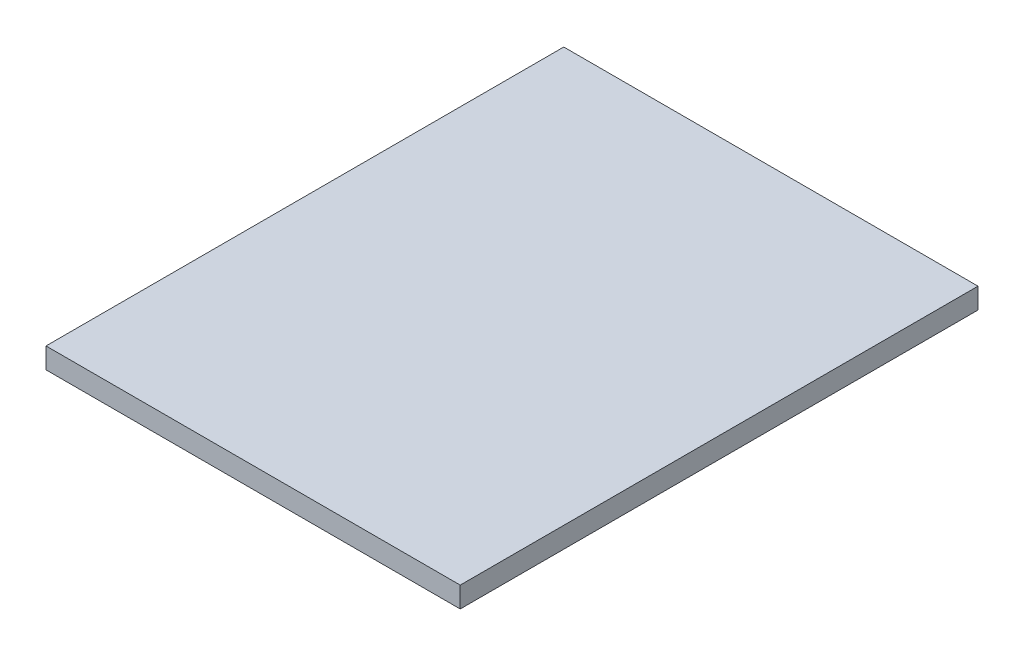
ISO-10303-21;
HEADER;
FILE_DESCRIPTION(('STEP AP214'),'2;1');
FILE_NAME('part.step','',(''),(''),'','','');
FILE_SCHEMA(('AUTOMOTIVE_DESIGN { 1 0 10303 214 1 1 1 1 }'));
ENDSEC;
DATA;
#1=APPLICATION_CONTEXT('core data for automotive mechanical design processes');
#2=APPLICATION_PROTOCOL_DEFINITION('international standard','automotive_design',2000,#1);
#3=PRODUCT_CONTEXT('',#1,'mechanical');
#4=PRODUCT('Part','Part','',(#3));
#5=PRODUCT_RELATED_PRODUCT_CATEGORY('part','',(#4));
#6=PRODUCT_DEFINITION_FORMATION('','',#4);
#7=PRODUCT_DEFINITION_CONTEXT('part definition',#1,'design');
#8=PRODUCT_DEFINITION('design','',#6,#7);
#9=PRODUCT_DEFINITION_SHAPE('','',#8);
#10=(LENGTH_UNIT() NAMED_UNIT(*) SI_UNIT(.MILLI.,.METRE.));
#11=(NAMED_UNIT(*) PLANE_ANGLE_UNIT() SI_UNIT($,.RADIAN.));
#12=(NAMED_UNIT(*) SI_UNIT($,.STERADIAN.) SOLID_ANGLE_UNIT());
#13=UNCERTAINTY_MEASURE_WITH_UNIT(LENGTH_MEASURE(1.E-05),#10,'distance_accuracy_value','');
#14=(GEOMETRIC_REPRESENTATION_CONTEXT(3) GLOBAL_UNCERTAINTY_ASSIGNED_CONTEXT((#13)) GLOBAL_UNIT_ASSIGNED_CONTEXT((#10,
#11,#12)) REPRESENTATION_CONTEXT('',''));
#15=CARTESIAN_POINT('',(0.,0.,0.));
#16=DIRECTION('',(0.,0.,1.));
#17=DIRECTION('',(1.,0.,0.));
#18=AXIS2_PLACEMENT_3D('',#15,#16,#17);
#19=CARTESIAN_POINT('',(-100.,5.,250.));
#20=DIRECTION('',(1.,0.,0.));
#21=DIRECTION('',(0.,0.,-1.));
#22=AXIS2_PLACEMENT_3D('',#19,#20,#21);
#23=PLANE('',#22);
#24=DIRECTION('',(0.,-1.,0.));
#25=VECTOR('',#24,1.);
#26=CARTESIAN_POINT('',(-100.,5.,0.));
#27=LINE('',#26,#25);
#28=CARTESIAN_POINT('',(-100.,5.,0.));
#29=VERTEX_POINT('',#28);
#30=CARTESIAN_POINT('',(-100.,-5.,0.));
#31=VERTEX_POINT('',#30);
#32=EDGE_CURVE('E97',#29,#31,#27,.T.);
#33=ORIENTED_EDGE('',*,*,#32,.T.);
#34=DIRECTION('',(0.,0.,-1.));
#35=VECTOR('',#34,1.);
#36=CARTESIAN_POINT('',(-100.,-5.,250.));
#37=LINE('',#36,#35);
#38=CARTESIAN_POINT('',(-100.,-5.,250.));
#39=VERTEX_POINT('',#38);
#40=EDGE_CURVE('E11',#39,#31,#37,.T.);
#41=ORIENTED_EDGE('',*,*,#40,.F.);
#42=DIRECTION('',(0.,-1.,0.));
#43=VECTOR('',#42,1.);
#44=CARTESIAN_POINT('',(-100.,5.,250.));
#45=LINE('',#44,#43);
#46=CARTESIAN_POINT('',(-100.,5.,250.));
#47=VERTEX_POINT('',#46);
#48=EDGE_CURVE('E85',#47,#39,#45,.T.);
#49=ORIENTED_EDGE('',*,*,#48,.F.);
#50=DIRECTION('',(0.,0.,-1.));
#51=VECTOR('',#50,1.);
#52=CARTESIAN_POINT('',(-100.,5.,250.));
#53=LINE('',#52,#51);
#54=EDGE_CURVE('E93',#47,#29,#53,.T.);
#55=ORIENTED_EDGE('',*,*,#54,.T.);
#56=EDGE_LOOP('',(#33,#41,#49,#55));
#57=FACE_BOUND('',#56,.T.);
#58=ADVANCED_FACE('F34',(#57),#23,.F.);
#59=CARTESIAN_POINT('',(-100.,-5.,250.));
#60=DIRECTION('',(0.,1.,0.));
#61=DIRECTION('',(-1.,0.,0.));
#62=AXIS2_PLACEMENT_3D('',#59,#60,#61);
#63=PLANE('',#62);
#64=DIRECTION('',(1.,0.,0.));
#65=VECTOR('',#64,1.);
#66=CARTESIAN_POINT('',(-100.,-5.,0.));
#67=LINE('',#66,#65);
#68=CARTESIAN_POINT('',(100.,-4.99999999999999,0.));
#69=VERTEX_POINT('',#68);
#70=EDGE_CURVE('E89',#31,#69,#67,.T.);
#71=ORIENTED_EDGE('',*,*,#70,.T.);
#72=DIRECTION('',(0.,0.,-1.));
#73=VECTOR('',#72,1.);
#74=CARTESIAN_POINT('',(100.,-4.99999999999999,250.));
#75=LINE('',#74,#73);
#76=CARTESIAN_POINT('',(100.,-4.99999999999999,250.));
#77=VERTEX_POINT('',#76);
#78=EDGE_CURVE('E42',#77,#69,#75,.T.);
#79=ORIENTED_EDGE('',*,*,#78,.F.);
#80=DIRECTION('',(1.,0.,0.));
#81=VECTOR('',#80,1.);
#82=CARTESIAN_POINT('',(-100.,-5.,250.));
#83=LINE('',#82,#81);
#84=EDGE_CURVE('E80',#39,#77,#83,.T.);
#85=ORIENTED_EDGE('',*,*,#84,.F.);
#86=ORIENTED_EDGE('',*,*,#40,.T.);
#87=EDGE_LOOP('',(#71,#79,#85,#86));
#88=FACE_BOUND('',#87,.T.);
#89=ADVANCED_FACE('F88',(#88),#63,.F.);
#90=CARTESIAN_POINT('',(100.,4.99999999999999,250.));
#91=DIRECTION('',(-1.,0.,0.));
#92=DIRECTION('',(0.,0.,1.));
#93=AXIS2_PLACEMENT_3D('',#90,#91,#92);
#94=PLANE('',#93);
#95=DIRECTION('',(0.,1.,0.));
#96=VECTOR('',#95,1.);
#97=CARTESIAN_POINT('',(100.,4.99999999999999,0.));
#98=LINE('',#97,#96);
#99=CARTESIAN_POINT('',(100.,4.99999999999999,0.));
#100=VERTEX_POINT('',#99);
#101=EDGE_CURVE('E67',#69,#100,#98,.T.);
#102=ORIENTED_EDGE('',*,*,#101,.T.);
#103=DIRECTION('',(0.,0.,-1.));
#104=VECTOR('',#103,1.);
#105=CARTESIAN_POINT('',(100.,4.99999999999999,250.));
#106=LINE('',#105,#104);
#107=CARTESIAN_POINT('',(100.,4.99999999999999,250.));
#108=VERTEX_POINT('',#107);
#109=EDGE_CURVE('E90',#108,#100,#106,.T.);
#110=ORIENTED_EDGE('',*,*,#109,.F.);
#111=DIRECTION('',(0.,1.,0.));
#112=VECTOR('',#111,1.);
#113=CARTESIAN_POINT('',(100.,4.99999999999999,250.));
#114=LINE('',#113,#112);
#115=EDGE_CURVE('E83',#77,#108,#114,.T.);
#116=ORIENTED_EDGE('',*,*,#115,.F.);
#117=ORIENTED_EDGE('',*,*,#78,.T.);
#118=EDGE_LOOP('',(#102,#110,#116,#117));
#119=FACE_BOUND('',#118,.T.);
#120=ADVANCED_FACE('F91',(#119),#94,.F.);
#121=CARTESIAN_POINT('',(-100.,5.,250.));
#122=DIRECTION('',(0.,-1.,0.));
#123=DIRECTION('',(1.,0.,0.));
#124=AXIS2_PLACEMENT_3D('',#121,#122,#123);
#125=PLANE('',#124);
#126=DIRECTION('',(-1.,0.,0.));
#127=VECTOR('',#126,1.);
#128=CARTESIAN_POINT('',(-100.,5.,0.));
#129=LINE('',#128,#127);
#130=EDGE_CURVE('E73',#100,#29,#129,.T.);
#131=ORIENTED_EDGE('',*,*,#130,.T.);
#132=ORIENTED_EDGE('',*,*,#54,.F.);
#133=DIRECTION('',(-1.,0.,0.));
#134=VECTOR('',#133,1.);
#135=CARTESIAN_POINT('',(-100.,5.,250.));
#136=LINE('',#135,#134);
#137=EDGE_CURVE('E50',#108,#47,#136,.T.);
#138=ORIENTED_EDGE('',*,*,#137,.F.);
#139=ORIENTED_EDGE('',*,*,#109,.T.);
#140=EDGE_LOOP('',(#131,#132,#138,#139));
#141=FACE_BOUND('',#140,.T.);
#142=ADVANCED_FACE('F104',(#141),#125,.F.);
#143=CARTESIAN_POINT('',(0.,0.,250.));
#144=DIRECTION('',(0.,0.,1.));
#145=DIRECTION('',(1.,0.,0.));
#146=AXIS2_PLACEMENT_3D('',#143,#144,#145);
#147=PLANE('',#146);
#148=ORIENTED_EDGE('',*,*,#48,.T.);
#149=ORIENTED_EDGE('',*,*,#84,.T.);
#150=ORIENTED_EDGE('',*,*,#115,.T.);
#151=ORIENTED_EDGE('',*,*,#137,.T.);
#152=EDGE_LOOP('',(#148,#149,#150,#151));
#153=FACE_BOUND('',#152,.T.);
#154=ADVANCED_FACE('F81',(#153),#147,.T.);
#155=CARTESIAN_POINT('',(0.,0.,0.));
#156=DIRECTION('',(0.,0.,1.));
#157=DIRECTION('',(1.,0.,0.));
#158=AXIS2_PLACEMENT_3D('',#155,#156,#157);
#159=PLANE('',#158);
#160=ORIENTED_EDGE('',*,*,#32,.F.);
#161=ORIENTED_EDGE('',*,*,#130,.F.);
#162=ORIENTED_EDGE('',*,*,#101,.F.);
#163=ORIENTED_EDGE('',*,*,#70,.F.);
#164=EDGE_LOOP('',(#160,#161,#162,#163));
#165=FACE_BOUND('',#164,.T.);
#166=ADVANCED_FACE('F107',(#165),#159,.F.);
#167=CLOSED_SHELL('',(#58,#89,#120,#142,#154,#166));
#168=MANIFOLD_SOLID_BREP('B2',#167);
#169=ADVANCED_BREP_SHAPE_REPRESENTATION('',(#18,#168),#14);
#170=SHAPE_DEFINITION_REPRESENTATION(#9,#169);
ENDSEC;
END-ISO-10303-21;
